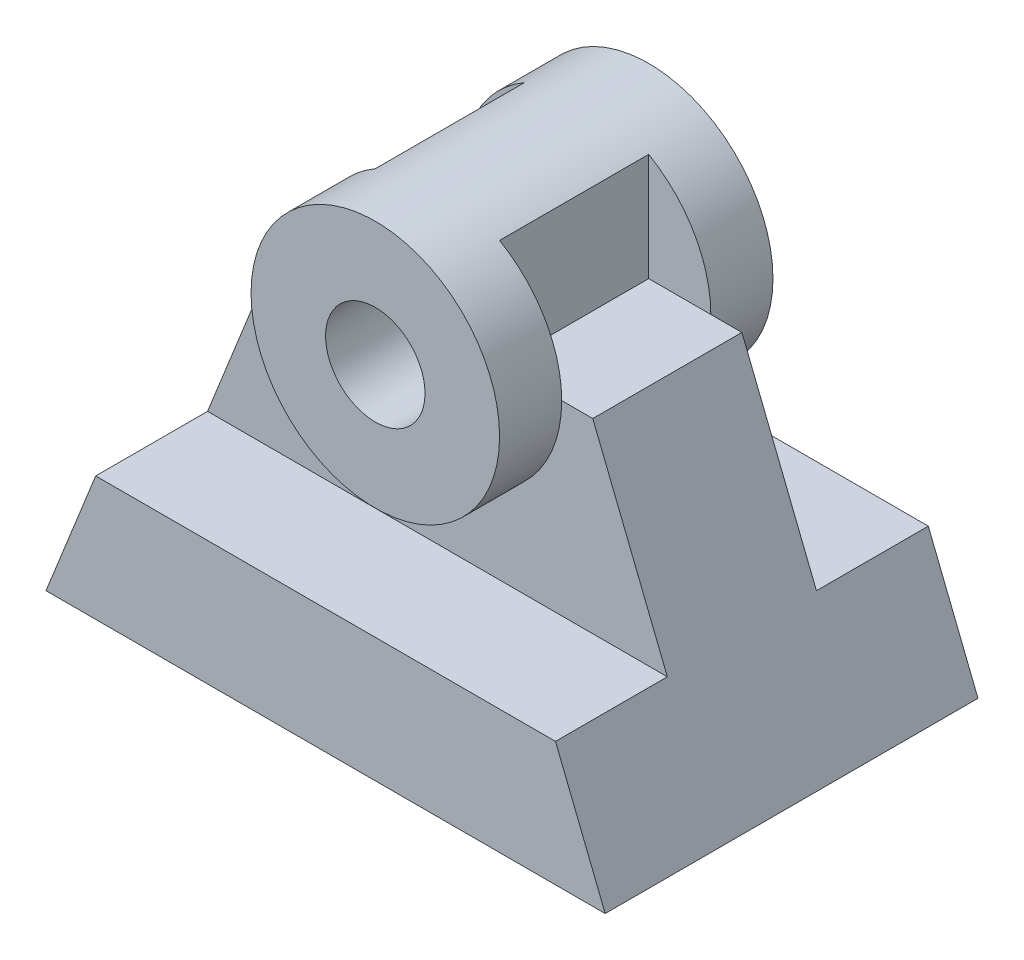
ISO-10303-21;
HEADER;
FILE_DESCRIPTION(('STEP AP214'),'2;1');
FILE_NAME('part.step','',(''),(''),'','','');
FILE_SCHEMA(('AUTOMOTIVE_DESIGN { 1 0 10303 214 1 1 1 1 }'));
ENDSEC;
DATA;
#1=APPLICATION_CONTEXT('core data for automotive mechanical design processes');
#2=APPLICATION_PROTOCOL_DEFINITION('international standard','automotive_design',2000,#1);
#3=PRODUCT_CONTEXT('',#1,'mechanical');
#4=PRODUCT('Part','Part','',(#3));
#5=PRODUCT_RELATED_PRODUCT_CATEGORY('part','',(#4));
#6=PRODUCT_DEFINITION_FORMATION('','',#4);
#7=PRODUCT_DEFINITION_CONTEXT('part definition',#1,'design');
#8=PRODUCT_DEFINITION('design','',#6,#7);
#9=PRODUCT_DEFINITION_SHAPE('','',#8);
#10=(LENGTH_UNIT() NAMED_UNIT(*) SI_UNIT(.MILLI.,.METRE.));
#11=(NAMED_UNIT(*) PLANE_ANGLE_UNIT() SI_UNIT($,.RADIAN.));
#12=(NAMED_UNIT(*) SI_UNIT($,.STERADIAN.) SOLID_ANGLE_UNIT());
#13=UNCERTAINTY_MEASURE_WITH_UNIT(LENGTH_MEASURE(1.E-05),#10,'distance_accuracy_value','');
#14=(GEOMETRIC_REPRESENTATION_CONTEXT(3) GLOBAL_UNCERTAINTY_ASSIGNED_CONTEXT((#13)) GLOBAL_UNIT_ASSIGNED_CONTEXT((#10,
#11,#12)) REPRESENTATION_CONTEXT('',''));
#15=CARTESIAN_POINT('',(0.,0.,0.));
#16=DIRECTION('',(0.,0.,1.));
#17=DIRECTION('',(1.,0.,0.));
#18=AXIS2_PLACEMENT_3D('',#15,#16,#17);
#19=CARTESIAN_POINT('',(0.,50.,22.));
#20=DIRECTION('',(0.,0.,-1.));
#21=DIRECTION('',(-1.,0.,0.));
#22=AXIS2_PLACEMENT_3D('',#19,#20,#21);
#23=CYLINDRICAL_SURFACE('',#22,20.);
#24=CARTESIAN_POINT('',(0.,50.,22.));
#25=DIRECTION('',(0.,0.,1.));
#26=DIRECTION('',(1.,0.,0.));
#27=AXIS2_PLACEMENT_3D('',#24,#25,#26);
#28=CIRCLE('',#27,20.);
#29=CARTESIAN_POINT('',(20.,50.,22.));
#30=VERTEX_POINT('',#29);
#31=EDGE_CURVE('E164',#30,#30,#28,.T.);
#32=ORIENTED_EDGE('',*,*,#31,.F.);
#33=EDGE_LOOP('',(#32));
#34=FACE_BOUND('',#33,.T.);
#35=CARTESIAN_POINT('',(0.,50.,-22.));
#36=DIRECTION('',(0.,0.,1.));
#37=DIRECTION('',(1.,0.,0.));
#38=AXIS2_PLACEMENT_3D('',#35,#36,#37);
#39=CIRCLE('',#38,20.);
#40=CARTESIAN_POINT('',(20.,50.,-22.));
#41=VERTEX_POINT('',#40);
#42=EDGE_CURVE('E278',#41,#41,#39,.T.);
#43=ORIENTED_EDGE('',*,*,#42,.T.);
#44=EDGE_LOOP('',(#43));
#45=FACE_BOUND('',#44,.T.);
#46=CARTESIAN_POINT('',(0.,50.,-12.));
#47=DIRECTION('',(0.,0.,1.));
#48=DIRECTION('',(1.,0.,0.));
#49=AXIS2_PLACEMENT_3D('',#46,#47,#48);
#50=CIRCLE('',#49,20.);
#51=CARTESIAN_POINT('',(20.,50.,-12.));
#52=VERTEX_POINT('',#51);
#53=CARTESIAN_POINT('',(10.,67.3205080756888,-12.));
#54=VERTEX_POINT('',#53);
#55=EDGE_CURVE('E139',#52,#54,#50,.T.);
#56=ORIENTED_EDGE('',*,*,#55,.F.);
#57=CARTESIAN_POINT('',(0.,50.,-12.));
#58=DIRECTION('',(0.,0.,1.));
#59=DIRECTION('',(0.,-1.,0.));
#60=AXIS2_PLACEMENT_3D('',#57,#58,#59);
#61=CIRCLE('',#60,20.);
#62=CARTESIAN_POINT('',(-20.,50.,-12.));
#63=VERTEX_POINT('',#62);
#64=EDGE_CURVE('E151',#52,#63,#61,.F.);
#65=ORIENTED_EDGE('',*,*,#64,.T.);
#66=CARTESIAN_POINT('',(0.,50.,-12.));
#67=DIRECTION('',(0.,0.,1.));
#68=DIRECTION('',(1.,0.,0.));
#69=AXIS2_PLACEMENT_3D('',#66,#67,#68);
#70=CIRCLE('',#69,20.);
#71=CARTESIAN_POINT('',(-10.,67.3205080756888,-12.));
#72=VERTEX_POINT('',#71);
#73=EDGE_CURVE('E255',#72,#63,#70,.T.);
#74=ORIENTED_EDGE('',*,*,#73,.F.);
#75=DIRECTION('',(0.,0.,1.));
#76=VECTOR('',#75,1.);
#77=CARTESIAN_POINT('',(-10.,67.3205080756888,-12.));
#78=LINE('',#77,#76);
#79=CARTESIAN_POINT('',(-10.,67.3205080756888,12.));
#80=VERTEX_POINT('',#79);
#81=EDGE_CURVE('E271',#72,#80,#78,.T.);
#82=ORIENTED_EDGE('',*,*,#81,.T.);
#83=CARTESIAN_POINT('',(0.,50.,12.));
#84=DIRECTION('',(0.,0.,1.));
#85=DIRECTION('',(1.,0.,0.));
#86=AXIS2_PLACEMENT_3D('',#83,#84,#85);
#87=CIRCLE('',#86,20.);
#88=CARTESIAN_POINT('',(-20.,50.,12.));
#89=VERTEX_POINT('',#88);
#90=EDGE_CURVE('E267',#80,#89,#87,.T.);
#91=ORIENTED_EDGE('',*,*,#90,.T.);
#92=CARTESIAN_POINT('',(0.,50.,12.));
#93=DIRECTION('',(0.,0.,-1.));
#94=DIRECTION('',(0.,1.,0.));
#95=AXIS2_PLACEMENT_3D('',#92,#93,#94);
#96=CIRCLE('',#95,20.);
#97=CARTESIAN_POINT('',(20.,50.,12.));
#98=VERTEX_POINT('',#97);
#99=EDGE_CURVE('E11',#89,#98,#96,.F.);
#100=ORIENTED_EDGE('',*,*,#99,.T.);
#101=CARTESIAN_POINT('',(0.,50.,12.));
#102=DIRECTION('',(0.,0.,1.));
#103=DIRECTION('',(1.,0.,0.));
#104=AXIS2_PLACEMENT_3D('',#101,#102,#103);
#105=CIRCLE('',#104,20.);
#106=CARTESIAN_POINT('',(10.,67.3205080756888,12.));
#107=VERTEX_POINT('',#106);
#108=EDGE_CURVE('E297',#98,#107,#105,.T.);
#109=ORIENTED_EDGE('',*,*,#108,.T.);
#110=DIRECTION('',(0.,0.,1.));
#111=VECTOR('',#110,1.);
#112=CARTESIAN_POINT('',(10.,67.3205080756888,-12.));
#113=LINE('',#112,#111);
#114=EDGE_CURVE('E153',#54,#107,#113,.T.);
#115=ORIENTED_EDGE('',*,*,#114,.F.);
#116=EDGE_LOOP('',(#56,#65,#74,#82,#91,#100,#109,#115));
#117=FACE_BOUND('',#116,.T.);
#118=ADVANCED_FACE('F33',(#34,#45,#117),#23,.T.);
#119=CARTESIAN_POINT('',(25.,50.,30.));
#120=DIRECTION('',(0.,-1.,0.));
#121=DIRECTION('',(0.,0.,-1.));
#122=AXIS2_PLACEMENT_3D('',#119,#120,#121);
#123=PLANE('',#122);
#124=DIRECTION('',(1.,0.,0.));
#125=VECTOR('',#124,1.);
#126=CARTESIAN_POINT('',(-45.,50.,12.));
#127=LINE('',#126,#125);
#128=CARTESIAN_POINT('',(-25.,50.,12.));
#129=VERTEX_POINT('',#128);
#130=EDGE_CURVE('E225',#129,#89,#127,.T.);
#131=ORIENTED_EDGE('',*,*,#130,.T.);
#132=DIRECTION('',(1.,0.,0.));
#133=VECTOR('',#132,1.);
#134=CARTESIAN_POINT('',(-20.,50.,12.));
#135=LINE('',#134,#133);
#136=CARTESIAN_POINT('',(-10.,50.,12.));
#137=VERTEX_POINT('',#136);
#138=EDGE_CURVE('E48',#89,#137,#135,.T.);
#139=ORIENTED_EDGE('',*,*,#138,.T.);
#140=DIRECTION('',(0.,0.,1.));
#141=VECTOR('',#140,1.);
#142=CARTESIAN_POINT('',(-10.,50.,-12.));
#143=LINE('',#142,#141);
#144=CARTESIAN_POINT('',(-10.,50.,-12.));
#145=VERTEX_POINT('',#144);
#146=EDGE_CURVE('E250',#145,#137,#143,.T.);
#147=ORIENTED_EDGE('',*,*,#146,.F.);
#148=DIRECTION('',(1.,0.,0.));
#149=VECTOR('',#148,1.);
#150=CARTESIAN_POINT('',(-20.,50.,-12.));
#151=LINE('',#150,#149);
#152=EDGE_CURVE('E248',#63,#145,#151,.T.);
#153=ORIENTED_EDGE('',*,*,#152,.F.);
#154=DIRECTION('',(1.,0.,0.));
#155=VECTOR('',#154,1.);
#156=CARTESIAN_POINT('',(-45.,50.,-12.));
#157=LINE('',#156,#155);
#158=CARTESIAN_POINT('',(-25.,50.,-12.));
#159=VERTEX_POINT('',#158);
#160=EDGE_CURVE('E162',#159,#63,#157,.T.);
#161=ORIENTED_EDGE('',*,*,#160,.F.);
#162=DIRECTION('',(0.,0.,-1.));
#163=VECTOR('',#162,1.);
#164=CARTESIAN_POINT('',(-25.,50.,30.));
#165=LINE('',#164,#163);
#166=EDGE_CURVE('E198',#129,#159,#165,.T.);
#167=ORIENTED_EDGE('',*,*,#166,.F.);
#168=EDGE_LOOP('',(#131,#139,#147,#153,#161,#167));
#169=FACE_BOUND('',#168,.T.);
#170=ADVANCED_FACE('F246',(#169),#123,.F.);
#171=CARTESIAN_POINT('',(25.,50.,-12.));
#172=VERTEX_POINT('',#171);
#173=EDGE_CURVE('E158',#52,#172,#157,.T.);
#174=ORIENTED_EDGE('',*,*,#173,.F.);
#175=DIRECTION('',(1.,0.,0.));
#176=VECTOR('',#175,1.);
#177=CARTESIAN_POINT('',(20.,50.,-12.));
#178=LINE('',#177,#176);
#179=CARTESIAN_POINT('',(10.,50.,-12.));
#180=VERTEX_POINT('',#179);
#181=EDGE_CURVE('E136',#180,#52,#178,.T.);
#182=ORIENTED_EDGE('',*,*,#181,.F.);
#183=DIRECTION('',(0.,0.,1.));
#184=VECTOR('',#183,1.);
#185=CARTESIAN_POINT('',(10.,50.,-12.));
#186=LINE('',#185,#184);
#187=CARTESIAN_POINT('',(10.,50.,12.));
#188=VERTEX_POINT('',#187);
#189=EDGE_CURVE('E269',#180,#188,#186,.T.);
#190=ORIENTED_EDGE('',*,*,#189,.T.);
#191=DIRECTION('',(1.,0.,0.));
#192=VECTOR('',#191,1.);
#193=CARTESIAN_POINT('',(20.,50.,12.));
#194=LINE('',#193,#192);
#195=EDGE_CURVE('E301',#188,#98,#194,.T.);
#196=ORIENTED_EDGE('',*,*,#195,.T.);
#197=CARTESIAN_POINT('',(25.,50.,12.));
#198=VERTEX_POINT('',#197);
#199=EDGE_CURVE('E286',#98,#198,#127,.T.);
#200=ORIENTED_EDGE('',*,*,#199,.T.);
#201=DIRECTION('',(0.,0.,-1.));
#202=VECTOR('',#201,1.);
#203=CARTESIAN_POINT('',(25.,50.,30.));
#204=LINE('',#203,#202);
#205=EDGE_CURVE('E168',#198,#172,#204,.T.);
#206=ORIENTED_EDGE('',*,*,#205,.T.);
#207=EDGE_LOOP('',(#174,#182,#190,#196,#200,#206));
#208=FACE_BOUND('',#207,.T.);
#209=ADVANCED_FACE('F166',(#208),#123,.F.);
#210=CARTESIAN_POINT('',(-25.,50.,30.));
#211=DIRECTION('',(0.928476690885259,-0.371390676354104,0.));
#212=DIRECTION('',(0.371390676354104,0.928476690885259,0.));
#213=AXIS2_PLACEMENT_3D('',#210,#211,#212);
#214=PLANE('',#213);
#215=DIRECTION('',(0.,0.,-1.));
#216=VECTOR('',#215,1.);
#217=CARTESIAN_POINT('',(-37.,20.,30.));
#218=LINE('',#217,#216);
#219=CARTESIAN_POINT('',(-37.,20.,30.));
#220=VERTEX_POINT('',#219);
#221=CARTESIAN_POINT('',(-37.,20.,12.));
#222=VERTEX_POINT('',#221);
#223=EDGE_CURVE('E56',#220,#222,#218,.T.);
#224=ORIENTED_EDGE('',*,*,#223,.T.);
#225=DIRECTION('',(0.371390676354104,0.928476690885259,0.));
#226=VECTOR('',#225,1.);
#227=CARTESIAN_POINT('',(-25.,50.,12.));
#228=LINE('',#227,#226);
#229=EDGE_CURVE('E170',#222,#129,#228,.T.);
#230=ORIENTED_EDGE('',*,*,#229,.T.);
#231=ORIENTED_EDGE('',*,*,#166,.T.);
#232=DIRECTION('',(-0.371390676354104,-0.928476690885259,0.));
#233=VECTOR('',#232,1.);
#234=CARTESIAN_POINT('',(-25.,50.,-12.));
#235=LINE('',#234,#233);
#236=CARTESIAN_POINT('',(-37.,20.,-12.));
#237=VERTEX_POINT('',#236);
#238=EDGE_CURVE('E186',#159,#237,#235,.T.);
#239=ORIENTED_EDGE('',*,*,#238,.T.);
#240=DIRECTION('',(0.,0.,-1.));
#241=VECTOR('',#240,1.);
#242=CARTESIAN_POINT('',(-37.,20.,30.));
#243=LINE('',#242,#241);
#244=CARTESIAN_POINT('',(-37.,20.,-30.));
#245=VERTEX_POINT('',#244);
#246=EDGE_CURVE('E181',#237,#245,#243,.T.);
#247=ORIENTED_EDGE('',*,*,#246,.T.);
#248=DIRECTION('',(-0.371390676354104,-0.928476690885259,0.));
#249=VECTOR('',#248,1.);
#250=CARTESIAN_POINT('',(-25.,50.,-30.));
#251=LINE('',#250,#249);
#252=CARTESIAN_POINT('',(-45.,0.,-30.));
#253=VERTEX_POINT('',#252);
#254=EDGE_CURVE('E189',#245,#253,#251,.T.);
#255=ORIENTED_EDGE('',*,*,#254,.T.);
#256=DIRECTION('',(0.,0.,-1.));
#257=VECTOR('',#256,1.);
#258=CARTESIAN_POINT('',(-45.,0.,30.));
#259=LINE('',#258,#257);
#260=CARTESIAN_POINT('',(-45.,0.,30.));
#261=VERTEX_POINT('',#260);
#262=EDGE_CURVE('E209',#261,#253,#259,.T.);
#263=ORIENTED_EDGE('',*,*,#262,.F.);
#264=DIRECTION('',(-0.371390676354104,-0.928476690885259,0.));
#265=VECTOR('',#264,1.);
#266=CARTESIAN_POINT('',(-25.,50.,30.));
#267=LINE('',#266,#265);
#268=EDGE_CURVE('E190',#220,#261,#267,.T.);
#269=ORIENTED_EDGE('',*,*,#268,.F.);
#270=EDGE_LOOP('',(#224,#230,#231,#239,#247,#255,#263,#269));
#271=FACE_BOUND('',#270,.T.);
#272=ADVANCED_FACE('F35',(#271),#214,.F.);
#273=CARTESIAN_POINT('',(-45.,0.,30.));
#274=DIRECTION('',(0.,1.,0.));
#275=DIRECTION('',(0.,0.,1.));
#276=AXIS2_PLACEMENT_3D('',#273,#274,#275);
#277=PLANE('',#276);
#278=DIRECTION('',(1.,0.,0.));
#279=VECTOR('',#278,1.);
#280=CARTESIAN_POINT('',(-45.,0.,-30.));
#281=LINE('',#280,#279);
#282=CARTESIAN_POINT('',(45.,0.,-30.));
#283=VERTEX_POINT('',#282);
#284=EDGE_CURVE('E200',#253,#283,#281,.T.);
#285=ORIENTED_EDGE('',*,*,#284,.T.);
#286=DIRECTION('',(0.,0.,-1.));
#287=VECTOR('',#286,1.);
#288=CARTESIAN_POINT('',(45.,0.,30.));
#289=LINE('',#288,#287);
#290=CARTESIAN_POINT('',(45.,0.,30.));
#291=VERTEX_POINT('',#290);
#292=EDGE_CURVE('E206',#291,#283,#289,.T.);
#293=ORIENTED_EDGE('',*,*,#292,.F.);
#294=DIRECTION('',(1.,0.,0.));
#295=VECTOR('',#294,1.);
#296=CARTESIAN_POINT('',(-45.,0.,30.));
#297=LINE('',#296,#295);
#298=EDGE_CURVE('E192',#261,#291,#297,.T.);
#299=ORIENTED_EDGE('',*,*,#298,.F.);
#300=ORIENTED_EDGE('',*,*,#262,.T.);
#301=EDGE_LOOP('',(#285,#293,#299,#300));
#302=FACE_BOUND('',#301,.T.);
#303=ADVANCED_FACE('F232',(#302),#277,.F.);
#304=CARTESIAN_POINT('',(45.,0.,30.));
#305=DIRECTION('',(-0.928476690885259,-0.371390676354104,0.));
#306=DIRECTION('',(0.371390676354104,-0.928476690885259,0.));
#307=AXIS2_PLACEMENT_3D('',#304,#305,#306);
#308=PLANE('',#307);
#309=ORIENTED_EDGE('',*,*,#205,.F.);
#310=DIRECTION('',(0.371390676354104,-0.928476690885259,0.));
#311=VECTOR('',#310,1.);
#312=CARTESIAN_POINT('',(45.,0.,12.));
#313=LINE('',#312,#311);
#314=CARTESIAN_POINT('',(37.,20.,12.));
#315=VERTEX_POINT('',#314);
#316=EDGE_CURVE('E174',#198,#315,#313,.T.);
#317=ORIENTED_EDGE('',*,*,#316,.T.);
#318=DIRECTION('',(0.,0.,1.));
#319=VECTOR('',#318,1.);
#320=CARTESIAN_POINT('',(37.,20.,30.));
#321=LINE('',#320,#319);
#322=CARTESIAN_POINT('',(37.,20.,30.));
#323=VERTEX_POINT('',#322);
#324=EDGE_CURVE('E216',#315,#323,#321,.T.);
#325=ORIENTED_EDGE('',*,*,#324,.T.);
#326=DIRECTION('',(-0.371390676354104,0.928476690885259,0.));
#327=VECTOR('',#326,1.);
#328=CARTESIAN_POINT('',(45.,0.,30.));
#329=LINE('',#328,#327);
#330=EDGE_CURVE('E195',#291,#323,#329,.T.);
#331=ORIENTED_EDGE('',*,*,#330,.F.);
#332=ORIENTED_EDGE('',*,*,#292,.T.);
#333=DIRECTION('',(-0.371390676354104,0.928476690885259,0.));
#334=VECTOR('',#333,1.);
#335=CARTESIAN_POINT('',(45.,0.,-30.));
#336=LINE('',#335,#334);
#337=CARTESIAN_POINT('',(37.,20.,-30.));
#338=VERTEX_POINT('',#337);
#339=EDGE_CURVE('E193',#283,#338,#336,.T.);
#340=ORIENTED_EDGE('',*,*,#339,.T.);
#341=DIRECTION('',(0.,0.,1.));
#342=VECTOR('',#341,1.);
#343=CARTESIAN_POINT('',(37.,20.,30.));
#344=LINE('',#343,#342);
#345=CARTESIAN_POINT('',(37.,20.,-12.));
#346=VERTEX_POINT('',#345);
#347=EDGE_CURVE('E178',#338,#346,#344,.T.);
#348=ORIENTED_EDGE('',*,*,#347,.T.);
#349=DIRECTION('',(-0.371390676354104,0.928476690885259,0.));
#350=VECTOR('',#349,1.);
#351=CARTESIAN_POINT('',(45.,0.,-12.));
#352=LINE('',#351,#350);
#353=EDGE_CURVE('E184',#346,#172,#352,.T.);
#354=ORIENTED_EDGE('',*,*,#353,.T.);
#355=EDGE_LOOP('',(#309,#317,#325,#331,#332,#340,#348,#354));
#356=FACE_BOUND('',#355,.T.);
#357=ADVANCED_FACE('F223',(#356),#308,.F.);
#358=CARTESIAN_POINT('',(0.,0.,30.));
#359=DIRECTION('',(0.,0.,1.));
#360=DIRECTION('',(1.,0.,0.));
#361=AXIS2_PLACEMENT_3D('',#358,#359,#360);
#362=PLANE('',#361);
#363=DIRECTION('',(1.,0.,0.));
#364=VECTOR('',#363,1.);
#365=CARTESIAN_POINT('',(0.,20.,30.));
#366=LINE('',#365,#364);
#367=EDGE_CURVE('E41',#220,#323,#366,.T.);
#368=ORIENTED_EDGE('',*,*,#367,.F.);
#369=ORIENTED_EDGE('',*,*,#268,.T.);
#370=ORIENTED_EDGE('',*,*,#298,.T.);
#371=ORIENTED_EDGE('',*,*,#330,.T.);
#372=EDGE_LOOP('',(#368,#369,#370,#371));
#373=FACE_BOUND('',#372,.T.);
#374=ADVANCED_FACE('F227',(#373),#362,.T.);
#375=CARTESIAN_POINT('',(0.,0.,-30.));
#376=DIRECTION('',(0.,0.,1.));
#377=DIRECTION('',(1.,0.,0.));
#378=AXIS2_PLACEMENT_3D('',#375,#376,#377);
#379=PLANE('',#378);
#380=ORIENTED_EDGE('',*,*,#254,.F.);
#381=DIRECTION('',(1.,0.,0.));
#382=VECTOR('',#381,1.);
#383=CARTESIAN_POINT('',(0.,20.,-30.));
#384=LINE('',#383,#382);
#385=EDGE_CURVE('E212',#245,#338,#384,.T.);
#386=ORIENTED_EDGE('',*,*,#385,.T.);
#387=ORIENTED_EDGE('',*,*,#339,.F.);
#388=ORIENTED_EDGE('',*,*,#284,.F.);
#389=EDGE_LOOP('',(#380,#386,#387,#388));
#390=FACE_BOUND('',#389,.T.);
#391=ADVANCED_FACE('F237',(#390),#379,.F.);
#392=CARTESIAN_POINT('',(-45.,50.,-12.));
#393=DIRECTION('',(0.,0.,1.));
#394=DIRECTION('',(0.,-1.,0.));
#395=AXIS2_PLACEMENT_3D('',#392,#393,#394);
#396=PLANE('',#395);
#397=ORIENTED_EDGE('',*,*,#64,.F.);
#398=ORIENTED_EDGE('',*,*,#173,.T.);
#399=ORIENTED_EDGE('',*,*,#353,.F.);
#400=DIRECTION('',(1.,0.,0.));
#401=VECTOR('',#400,1.);
#402=CARTESIAN_POINT('',(-45.,20.,-12.));
#403=LINE('',#402,#401);
#404=EDGE_CURVE('E172',#237,#346,#403,.T.);
#405=ORIENTED_EDGE('',*,*,#404,.F.);
#406=ORIENTED_EDGE('',*,*,#238,.F.);
#407=ORIENTED_EDGE('',*,*,#160,.T.);
#408=EDGE_LOOP('',(#397,#398,#399,#405,#406,#407));
#409=FACE_BOUND('',#408,.T.);
#410=ADVANCED_FACE('F157',(#409),#396,.F.);
#411=CARTESIAN_POINT('',(-45.,20.,-30.));
#412=DIRECTION('',(0.,-1.,0.));
#413=DIRECTION('',(0.,0.,-1.));
#414=AXIS2_PLACEMENT_3D('',#411,#412,#413);
#415=PLANE('',#414);
#416=ORIENTED_EDGE('',*,*,#404,.T.);
#417=ORIENTED_EDGE('',*,*,#347,.F.);
#418=ORIENTED_EDGE('',*,*,#385,.F.);
#419=ORIENTED_EDGE('',*,*,#246,.F.);
#420=EDGE_LOOP('',(#416,#417,#418,#419));
#421=FACE_BOUND('',#420,.T.);
#422=ADVANCED_FACE('F240',(#421),#415,.F.);
#423=CARTESIAN_POINT('',(-45.,50.,12.));
#424=DIRECTION('',(0.,0.,-1.));
#425=DIRECTION('',(0.,1.,0.));
#426=AXIS2_PLACEMENT_3D('',#423,#424,#425);
#427=PLANE('',#426);
#428=ORIENTED_EDGE('',*,*,#99,.F.);
#429=ORIENTED_EDGE('',*,*,#130,.F.);
#430=ORIENTED_EDGE('',*,*,#229,.F.);
#431=DIRECTION('',(1.,0.,0.));
#432=VECTOR('',#431,1.);
#433=CARTESIAN_POINT('',(-45.,20.,12.));
#434=LINE('',#433,#432);
#435=EDGE_CURVE('E163',#222,#315,#434,.T.);
#436=ORIENTED_EDGE('',*,*,#435,.T.);
#437=ORIENTED_EDGE('',*,*,#316,.F.);
#438=ORIENTED_EDGE('',*,*,#199,.F.);
#439=EDGE_LOOP('',(#428,#429,#430,#436,#437,#438));
#440=FACE_BOUND('',#439,.T.);
#441=ADVANCED_FACE('F291',(#440),#427,.F.);
#442=CARTESIAN_POINT('',(-45.,20.,30.));
#443=DIRECTION('',(0.,-1.,0.));
#444=DIRECTION('',(0.,0.,-1.));
#445=AXIS2_PLACEMENT_3D('',#442,#443,#444);
#446=PLANE('',#445);
#447=ORIENTED_EDGE('',*,*,#367,.T.);
#448=ORIENTED_EDGE('',*,*,#324,.F.);
#449=ORIENTED_EDGE('',*,*,#435,.F.);
#450=ORIENTED_EDGE('',*,*,#223,.F.);
#451=EDGE_LOOP('',(#447,#448,#449,#450));
#452=FACE_BOUND('',#451,.T.);
#453=ADVANCED_FACE('F215',(#452),#446,.F.);
#454=CARTESIAN_POINT('',(0.,50.,22.));
#455=DIRECTION('',(0.,0.,-1.));
#456=DIRECTION('',(-1.,0.,0.));
#457=AXIS2_PLACEMENT_3D('',#454,#455,#456);
#458=CYLINDRICAL_SURFACE('',#457,8.);
#459=CARTESIAN_POINT('',(0.,50.,-22.));
#460=DIRECTION('',(0.,0.,1.));
#461=DIRECTION('',(1.,0.,0.));
#462=AXIS2_PLACEMENT_3D('',#459,#460,#461);
#463=CIRCLE('',#462,8.);
#464=CARTESIAN_POINT('',(7.99999999999999,50.,-22.));
#465=VERTEX_POINT('',#464);
#466=EDGE_CURVE('E273',#465,#465,#463,.T.);
#467=ORIENTED_EDGE('',*,*,#466,.F.);
#468=EDGE_LOOP('',(#467));
#469=FACE_BOUND('',#468,.T.);
#470=CARTESIAN_POINT('',(0.,50.,22.));
#471=DIRECTION('',(0.,0.,1.));
#472=DIRECTION('',(1.,0.,0.));
#473=AXIS2_PLACEMENT_3D('',#470,#471,#472);
#474=CIRCLE('',#473,8.);
#475=CARTESIAN_POINT('',(7.99999999999999,50.,22.));
#476=VERTEX_POINT('',#475);
#477=EDGE_CURVE('E275',#476,#476,#474,.T.);
#478=ORIENTED_EDGE('',*,*,#477,.T.);
#479=EDGE_LOOP('',(#478));
#480=FACE_BOUND('',#479,.T.);
#481=ADVANCED_FACE('F334',(#469,#480),#458,.F.);
#482=CARTESIAN_POINT('',(0.,50.,22.));
#483=DIRECTION('',(0.,0.,1.));
#484=DIRECTION('',(1.,0.,0.));
#485=AXIS2_PLACEMENT_3D('',#482,#483,#484);
#486=PLANE('',#485);
#487=ORIENTED_EDGE('',*,*,#31,.T.);
#488=EDGE_LOOP('',(#487));
#489=FACE_BOUND('',#488,.T.);
#490=ORIENTED_EDGE('',*,*,#477,.F.);
#491=EDGE_LOOP('',(#490));
#492=FACE_BOUND('',#491,.T.);
#493=ADVANCED_FACE('F372',(#489,#492),#486,.T.);
#494=CARTESIAN_POINT('',(0.,50.,-22.));
#495=DIRECTION('',(0.,0.,1.));
#496=DIRECTION('',(1.,0.,0.));
#497=AXIS2_PLACEMENT_3D('',#494,#495,#496);
#498=PLANE('',#497);
#499=ORIENTED_EDGE('',*,*,#42,.F.);
#500=EDGE_LOOP('',(#499));
#501=FACE_BOUND('',#500,.T.);
#502=ORIENTED_EDGE('',*,*,#466,.T.);
#503=EDGE_LOOP('',(#502));
#504=FACE_BOUND('',#503,.T.);
#505=ADVANCED_FACE('F328',(#501,#504),#498,.F.);
#506=CARTESIAN_POINT('',(-10.,50.,-12.));
#507=DIRECTION('',(1.,0.,0.));
#508=DIRECTION('',(0.,0.,-1.));
#509=AXIS2_PLACEMENT_3D('',#506,#507,#508);
#510=PLANE('',#509);
#511=DIRECTION('',(0.,1.,0.));
#512=VECTOR('',#511,1.);
#513=CARTESIAN_POINT('',(-10.,50.,12.));
#514=LINE('',#513,#512);
#515=EDGE_CURVE('E259',#137,#80,#514,.T.);
#516=ORIENTED_EDGE('',*,*,#515,.T.);
#517=ORIENTED_EDGE('',*,*,#81,.F.);
#518=DIRECTION('',(0.,1.,0.));
#519=VECTOR('',#518,1.);
#520=CARTESIAN_POINT('',(-10.,50.,-12.));
#521=LINE('',#520,#519);
#522=EDGE_CURVE('E254',#145,#72,#521,.T.);
#523=ORIENTED_EDGE('',*,*,#522,.F.);
#524=ORIENTED_EDGE('',*,*,#146,.T.);
#525=EDGE_LOOP('',(#516,#517,#523,#524));
#526=FACE_BOUND('',#525,.T.);
#527=ADVANCED_FACE('F295',(#526),#510,.F.);
#528=CARTESIAN_POINT('',(0.,50.,-12.));
#529=DIRECTION('',(0.,0.,1.));
#530=DIRECTION('',(1.,0.,0.));
#531=AXIS2_PLACEMENT_3D('',#528,#529,#530);
#532=PLANE('',#531);
#533=ORIENTED_EDGE('',*,*,#73,.T.);
#534=ORIENTED_EDGE('',*,*,#152,.T.);
#535=ORIENTED_EDGE('',*,*,#522,.T.);
#536=EDGE_LOOP('',(#533,#534,#535));
#537=FACE_BOUND('',#536,.T.);
#538=ADVANCED_FACE('F257',(#537),#532,.T.);
#539=CARTESIAN_POINT('',(0.,50.,12.));
#540=DIRECTION('',(0.,0.,1.));
#541=DIRECTION('',(1.,0.,0.));
#542=AXIS2_PLACEMENT_3D('',#539,#540,#541);
#543=PLANE('',#542);
#544=ORIENTED_EDGE('',*,*,#90,.F.);
#545=ORIENTED_EDGE('',*,*,#515,.F.);
#546=ORIENTED_EDGE('',*,*,#138,.F.);
#547=EDGE_LOOP('',(#544,#545,#546));
#548=FACE_BOUND('',#547,.T.);
#549=ADVANCED_FACE('F293',(#548),#543,.F.);
#550=CARTESIAN_POINT('',(10.,50.,-12.));
#551=DIRECTION('',(-1.,0.,0.));
#552=DIRECTION('',(0.,0.,1.));
#553=AXIS2_PLACEMENT_3D('',#550,#551,#552);
#554=PLANE('',#553);
#555=DIRECTION('',(0.,-1.,0.));
#556=VECTOR('',#555,1.);
#557=CARTESIAN_POINT('',(10.,50.,12.));
#558=LINE('',#557,#556);
#559=EDGE_CURVE('E144',#107,#188,#558,.T.);
#560=ORIENTED_EDGE('',*,*,#559,.T.);
#561=ORIENTED_EDGE('',*,*,#189,.F.);
#562=DIRECTION('',(0.,-1.,0.));
#563=VECTOR('',#562,1.);
#564=CARTESIAN_POINT('',(10.,50.,-12.));
#565=LINE('',#564,#563);
#566=EDGE_CURVE('E141',#54,#180,#565,.T.);
#567=ORIENTED_EDGE('',*,*,#566,.F.);
#568=ORIENTED_EDGE('',*,*,#114,.T.);
#569=EDGE_LOOP('',(#560,#561,#567,#568));
#570=FACE_BOUND('',#569,.T.);
#571=ADVANCED_FACE('F308',(#570),#554,.F.);
#572=CARTESIAN_POINT('',(0.,50.,-12.));
#573=DIRECTION('',(0.,0.,1.));
#574=DIRECTION('',(1.,0.,0.));
#575=AXIS2_PLACEMENT_3D('',#572,#573,#574);
#576=PLANE('',#575);
#577=ORIENTED_EDGE('',*,*,#181,.T.);
#578=ORIENTED_EDGE('',*,*,#55,.T.);
#579=ORIENTED_EDGE('',*,*,#566,.T.);
#580=EDGE_LOOP('',(#577,#578,#579));
#581=FACE_BOUND('',#580,.T.);
#582=ADVANCED_FACE('F138',(#581),#576,.T.);
#583=CARTESIAN_POINT('',(0.,50.,12.));
#584=DIRECTION('',(0.,0.,1.));
#585=DIRECTION('',(1.,0.,0.));
#586=AXIS2_PLACEMENT_3D('',#583,#584,#585);
#587=PLANE('',#586);
#588=ORIENTED_EDGE('',*,*,#195,.F.);
#589=ORIENTED_EDGE('',*,*,#559,.F.);
#590=ORIENTED_EDGE('',*,*,#108,.F.);
#591=EDGE_LOOP('',(#588,#589,#590));
#592=FACE_BOUND('',#591,.T.);
#593=ADVANCED_FACE('F309',(#592),#587,.F.);
#594=CLOSED_SHELL('',(#118,#170,#209,#272,#303,#357,#374,#391,#410,#422,#441,#453,#481,#493,
#505,#527,#538,#549,#571,#582,#593));
#595=MANIFOLD_SOLID_BREP('B2',#594);
#596=ADVANCED_BREP_SHAPE_REPRESENTATION('',(#18,#595),#14);
#597=SHAPE_DEFINITION_REPRESENTATION(#9,#596);
ENDSEC;
END-ISO-10303-21;
